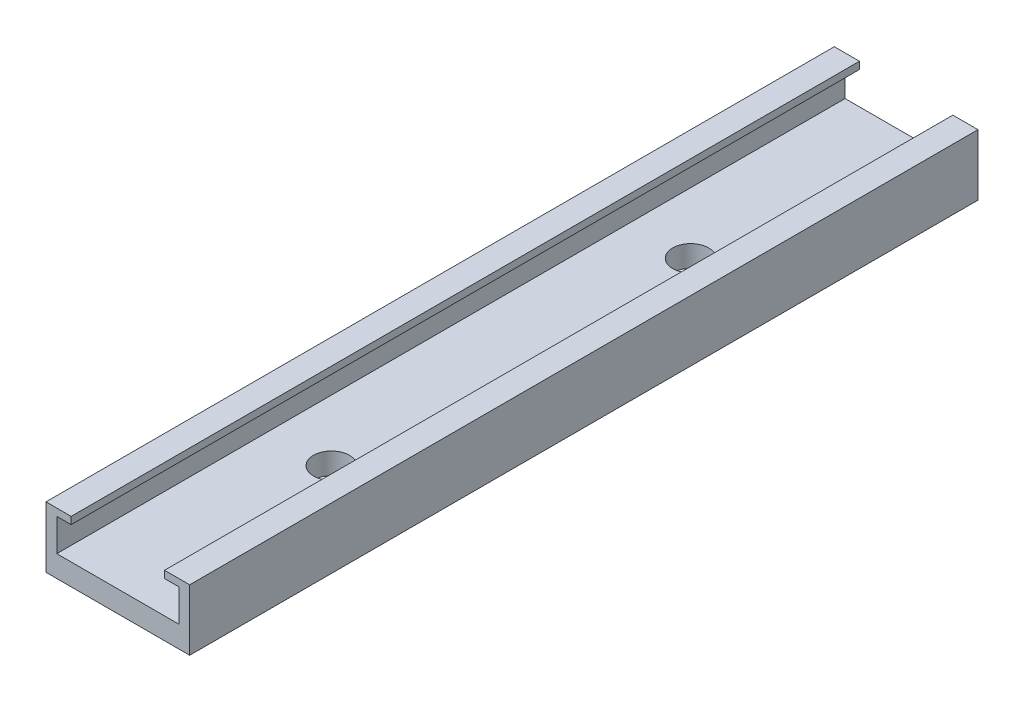
ISO-10303-21;
HEADER;
FILE_DESCRIPTION(('STEP AP214'),'2;1');
FILE_NAME('part.step','',(''),(''),'','','');
FILE_SCHEMA(('AUTOMOTIVE_DESIGN { 1 0 10303 214 1 1 1 1 }'));
ENDSEC;
DATA;
#1=APPLICATION_CONTEXT('core data for automotive mechanical design processes');
#2=APPLICATION_PROTOCOL_DEFINITION('international standard','automotive_design',2000,#1);
#3=PRODUCT_CONTEXT('',#1,'mechanical');
#4=PRODUCT('Part','Part','',(#3));
#5=PRODUCT_RELATED_PRODUCT_CATEGORY('part','',(#4));
#6=PRODUCT_DEFINITION_FORMATION('','',#4);
#7=PRODUCT_DEFINITION_CONTEXT('part definition',#1,'design');
#8=PRODUCT_DEFINITION('design','',#6,#7);
#9=PRODUCT_DEFINITION_SHAPE('','',#8);
#10=(LENGTH_UNIT() NAMED_UNIT(*) SI_UNIT(.MILLI.,.METRE.));
#11=(NAMED_UNIT(*) PLANE_ANGLE_UNIT() SI_UNIT($,.RADIAN.));
#12=(NAMED_UNIT(*) SI_UNIT($,.STERADIAN.) SOLID_ANGLE_UNIT());
#13=UNCERTAINTY_MEASURE_WITH_UNIT(LENGTH_MEASURE(1.E-05),#10,'distance_accuracy_value','');
#14=(GEOMETRIC_REPRESENTATION_CONTEXT(3) GLOBAL_UNCERTAINTY_ASSIGNED_CONTEXT((#13)) GLOBAL_UNIT_ASSIGNED_CONTEXT((#10,
#11,#12)) REPRESENTATION_CONTEXT('',''));
#15=CARTESIAN_POINT('',(0.,0.,0.));
#16=DIRECTION('',(0.,0.,1.));
#17=DIRECTION('',(1.,0.,0.));
#18=AXIS2_PLACEMENT_3D('',#15,#16,#17);
#19=CARTESIAN_POINT('',(10.,0.391567614114092,109.73));
#20=DIRECTION('',(-1.,0.,0.));
#21=DIRECTION('',(0.,-1.,0.));
#22=AXIS2_PLACEMENT_3D('',#19,#20,#21);
#23=PLANE('',#22);
#24=DIRECTION('',(0.,1.,0.));
#25=VECTOR('',#24,1.);
#26=CARTESIAN_POINT('',(10.,0.391567614114092,0.));
#27=LINE('',#26,#25);
#28=CARTESIAN_POINT('',(10.,-8.10843238588591,0.));
#29=VERTEX_POINT('',#28);
#30=CARTESIAN_POINT('',(10.,0.391567614114092,0.));
#31=VERTEX_POINT('',#30);
#32=EDGE_CURVE('E151',#29,#31,#27,.T.);
#33=ORIENTED_EDGE('',*,*,#32,.T.);
#34=DIRECTION('',(0.,0.,-1.));
#35=VECTOR('',#34,1.);
#36=CARTESIAN_POINT('',(10.,0.391567614114092,109.73));
#37=LINE('',#36,#35);
#38=CARTESIAN_POINT('',(10.,0.391567614114092,109.73));
#39=VERTEX_POINT('',#38);
#40=EDGE_CURVE('E11',#39,#31,#37,.T.);
#41=ORIENTED_EDGE('',*,*,#40,.F.);
#42=DIRECTION('',(0.,1.,0.));
#43=VECTOR('',#42,1.);
#44=CARTESIAN_POINT('',(10.,0.391567614114092,109.73));
#45=LINE('',#44,#43);
#46=CARTESIAN_POINT('',(10.,-8.10843238588591,109.73));
#47=VERTEX_POINT('',#46);
#48=EDGE_CURVE('E174',#47,#39,#45,.T.);
#49=ORIENTED_EDGE('',*,*,#48,.F.);
#50=DIRECTION('',(0.,0.,-1.));
#51=VECTOR('',#50,1.);
#52=CARTESIAN_POINT('',(10.,-8.10843238588591,109.73));
#53=LINE('',#52,#51);
#54=EDGE_CURVE('E147',#47,#29,#53,.T.);
#55=ORIENTED_EDGE('',*,*,#54,.T.);
#56=EDGE_LOOP('',(#33,#41,#49,#55));
#57=FACE_BOUND('',#56,.T.);
#58=ADVANCED_FACE('F31',(#57),#23,.F.);
#59=CARTESIAN_POINT('',(10.,0.391567614114092,109.73));
#60=DIRECTION('',(0.,-1.,0.));
#61=DIRECTION('',(1.,0.,0.));
#62=AXIS2_PLACEMENT_3D('',#59,#60,#61);
#63=PLANE('',#62);
#64=DIRECTION('',(-1.,0.,0.));
#65=VECTOR('',#64,1.);
#66=CARTESIAN_POINT('',(10.,0.391567614114092,0.));
#67=LINE('',#66,#65);
#68=CARTESIAN_POINT('',(6.50000000000001,0.391567614114092,0.));
#69=VERTEX_POINT('',#68);
#70=EDGE_CURVE('E154',#31,#69,#67,.T.);
#71=ORIENTED_EDGE('',*,*,#70,.T.);
#72=DIRECTION('',(0.,0.,-1.));
#73=VECTOR('',#72,1.);
#74=CARTESIAN_POINT('',(6.50000000000001,0.391567614114092,109.73));
#75=LINE('',#74,#73);
#76=CARTESIAN_POINT('',(6.50000000000001,0.391567614114092,109.73));
#77=VERTEX_POINT('',#76);
#78=EDGE_CURVE('E39',#77,#69,#75,.T.);
#79=ORIENTED_EDGE('',*,*,#78,.F.);
#80=DIRECTION('',(-1.,0.,0.));
#81=VECTOR('',#80,1.);
#82=CARTESIAN_POINT('',(10.,0.391567614114092,109.73));
#83=LINE('',#82,#81);
#84=EDGE_CURVE('E101',#39,#77,#83,.T.);
#85=ORIENTED_EDGE('',*,*,#84,.F.);
#86=ORIENTED_EDGE('',*,*,#40,.T.);
#87=EDGE_LOOP('',(#71,#79,#85,#86));
#88=FACE_BOUND('',#87,.T.);
#89=ADVANCED_FACE('F255',(#88),#63,.F.);
#90=CARTESIAN_POINT('',(6.50000000000001,0.391567614114092,109.73));
#91=DIRECTION('',(1.,0.,0.));
#92=DIRECTION('',(0.,0.,-1.));
#93=AXIS2_PLACEMENT_3D('',#90,#91,#92);
#94=PLANE('',#93);
#95=DIRECTION('',(0.,-1.,0.));
#96=VECTOR('',#95,1.);
#97=CARTESIAN_POINT('',(6.50000000000001,0.391567614114092,0.));
#98=LINE('',#97,#96);
#99=CARTESIAN_POINT('',(6.50000000000001,-0.608432385885908,0.));
#100=VERTEX_POINT('',#99);
#101=EDGE_CURVE('E157',#69,#100,#98,.T.);
#102=ORIENTED_EDGE('',*,*,#101,.T.);
#103=DIRECTION('',(0.,0.,-1.));
#104=VECTOR('',#103,1.);
#105=CARTESIAN_POINT('',(6.50000000000001,-0.608432385885908,109.73));
#106=LINE('',#105,#104);
#107=CARTESIAN_POINT('',(6.50000000000001,-0.608432385885908,109.73));
#108=VERTEX_POINT('',#107);
#109=EDGE_CURVE('E193',#108,#100,#106,.T.);
#110=ORIENTED_EDGE('',*,*,#109,.F.);
#111=DIRECTION('',(0.,-1.,0.));
#112=VECTOR('',#111,1.);
#113=CARTESIAN_POINT('',(6.50000000000001,0.391567614114092,109.73));
#114=LINE('',#113,#112);
#115=EDGE_CURVE('E201',#77,#108,#114,.T.);
#116=ORIENTED_EDGE('',*,*,#115,.F.);
#117=ORIENTED_EDGE('',*,*,#78,.T.);
#118=EDGE_LOOP('',(#102,#110,#116,#117));
#119=FACE_BOUND('',#118,.T.);
#120=ADVANCED_FACE('F199',(#119),#94,.F.);
#121=CARTESIAN_POINT('',(6.50000000000001,-0.608432385885908,109.73));
#122=DIRECTION('',(0.,1.,0.));
#123=DIRECTION('',(0.,0.,1.));
#124=AXIS2_PLACEMENT_3D('',#121,#122,#123);
#125=PLANE('',#124);
#126=DIRECTION('',(1.,0.,0.));
#127=VECTOR('',#126,1.);
#128=CARTESIAN_POINT('',(6.50000000000001,-0.608432385885908,0.));
#129=LINE('',#128,#127);
#130=CARTESIAN_POINT('',(8.50000000000001,-0.608432385885908,0.));
#131=VERTEX_POINT('',#130);
#132=EDGE_CURVE('E159',#100,#131,#129,.T.);
#133=ORIENTED_EDGE('',*,*,#132,.T.);
#134=DIRECTION('',(0.,0.,-1.));
#135=VECTOR('',#134,1.);
#136=CARTESIAN_POINT('',(8.50000000000001,-0.608432385885908,109.73));
#137=LINE('',#136,#135);
#138=CARTESIAN_POINT('',(8.50000000000001,-0.608432385885908,109.73));
#139=VERTEX_POINT('',#138);
#140=EDGE_CURVE('E190',#139,#131,#137,.T.);
#141=ORIENTED_EDGE('',*,*,#140,.F.);
#142=DIRECTION('',(1.,0.,0.));
#143=VECTOR('',#142,1.);
#144=CARTESIAN_POINT('',(6.50000000000001,-0.608432385885908,109.73));
#145=LINE('',#144,#143);
#146=EDGE_CURVE('E219',#108,#139,#145,.T.);
#147=ORIENTED_EDGE('',*,*,#146,.F.);
#148=ORIENTED_EDGE('',*,*,#109,.T.);
#149=EDGE_LOOP('',(#133,#141,#147,#148));
#150=FACE_BOUND('',#149,.T.);
#151=ADVANCED_FACE('F210',(#150),#125,.F.);
#152=CARTESIAN_POINT('',(8.50000000000001,-0.608432385885908,109.73));
#153=DIRECTION('',(1.,0.,0.));
#154=DIRECTION('',(0.,0.,-1.));
#155=AXIS2_PLACEMENT_3D('',#152,#153,#154);
#156=PLANE('',#155);
#157=DIRECTION('',(0.,-1.,0.));
#158=VECTOR('',#157,1.);
#159=CARTESIAN_POINT('',(8.50000000000001,-0.608432385885908,0.));
#160=LINE('',#159,#158);
#161=CARTESIAN_POINT('',(8.50000000000001,-5.10843238588591,0.));
#162=VERTEX_POINT('',#161);
#163=EDGE_CURVE('E161',#131,#162,#160,.T.);
#164=ORIENTED_EDGE('',*,*,#163,.T.);
#165=DIRECTION('',(0.,0.,-1.));
#166=VECTOR('',#165,1.);
#167=CARTESIAN_POINT('',(8.50000000000001,-5.10843238588591,109.73));
#168=LINE('',#167,#166);
#169=CARTESIAN_POINT('',(8.50000000000001,-5.10843238588591,109.73));
#170=VERTEX_POINT('',#169);
#171=EDGE_CURVE('E187',#170,#162,#168,.T.);
#172=ORIENTED_EDGE('',*,*,#171,.F.);
#173=DIRECTION('',(0.,-1.,0.));
#174=VECTOR('',#173,1.);
#175=CARTESIAN_POINT('',(8.50000000000001,-0.608432385885908,109.73));
#176=LINE('',#175,#174);
#177=EDGE_CURVE('E216',#139,#170,#176,.T.);
#178=ORIENTED_EDGE('',*,*,#177,.F.);
#179=ORIENTED_EDGE('',*,*,#140,.T.);
#180=EDGE_LOOP('',(#164,#172,#178,#179));
#181=FACE_BOUND('',#180,.T.);
#182=ADVANCED_FACE('F214',(#181),#156,.F.);
#183=CARTESIAN_POINT('',(8.50000000000001,-5.10843238588591,109.73));
#184=DIRECTION('',(0.,-1.,0.));
#185=DIRECTION('',(1.,0.,0.));
#186=AXIS2_PLACEMENT_3D('',#183,#184,#185);
#187=PLANE('',#186);
#188=CARTESIAN_POINT('',(0.,-5.10843238588591,80.));
#189=DIRECTION('',(0.,-1.,0.));
#190=DIRECTION('',(1.,0.,0.));
#191=AXIS2_PLACEMENT_3D('',#188,#189,#190);
#192=CIRCLE('',#191,2.5);
#193=CARTESIAN_POINT('',(2.5,-5.10843238588591,80.));
#194=VERTEX_POINT('',#193);
#195=EDGE_CURVE('E344',#194,#194,#192,.T.);
#196=ORIENTED_EDGE('',*,*,#195,.T.);
#197=EDGE_LOOP('',(#196));
#198=FACE_BOUND('',#197,.T.);
#199=CARTESIAN_POINT('',(0.,-5.10843238588591,30.));
#200=DIRECTION('',(0.,-1.,0.));
#201=DIRECTION('',(1.,0.,0.));
#202=AXIS2_PLACEMENT_3D('',#199,#200,#201);
#203=CIRCLE('',#202,2.5);
#204=CARTESIAN_POINT('',(2.5,-5.10843238588591,30.));
#205=VERTEX_POINT('',#204);
#206=EDGE_CURVE('E155',#205,#205,#203,.T.);
#207=ORIENTED_EDGE('',*,*,#206,.T.);
#208=EDGE_LOOP('',(#207));
#209=FACE_BOUND('',#208,.T.);
#210=DIRECTION('',(-1.,0.,0.));
#211=VECTOR('',#210,1.);
#212=CARTESIAN_POINT('',(8.50000000000001,-5.10843238588591,0.));
#213=LINE('',#212,#211);
#214=CARTESIAN_POINT('',(-8.49999999999999,-5.10843238588591,0.));
#215=VERTEX_POINT('',#214);
#216=EDGE_CURVE('E163',#162,#215,#213,.T.);
#217=ORIENTED_EDGE('',*,*,#216,.T.);
#218=DIRECTION('',(0.,0.,-1.));
#219=VECTOR('',#218,1.);
#220=CARTESIAN_POINT('',(-8.49999999999999,-5.10843238588591,109.73));
#221=LINE('',#220,#219);
#222=CARTESIAN_POINT('',(-8.49999999999999,-5.10843238588591,109.73));
#223=VERTEX_POINT('',#222);
#224=EDGE_CURVE('E184',#223,#215,#221,.T.);
#225=ORIENTED_EDGE('',*,*,#224,.F.);
#226=DIRECTION('',(-1.,0.,0.));
#227=VECTOR('',#226,1.);
#228=CARTESIAN_POINT('',(8.50000000000001,-5.10843238588591,109.73));
#229=LINE('',#228,#227);
#230=EDGE_CURVE('E218',#170,#223,#229,.T.);
#231=ORIENTED_EDGE('',*,*,#230,.F.);
#232=ORIENTED_EDGE('',*,*,#171,.T.);
#233=EDGE_LOOP('',(#217,#225,#231,#232));
#234=FACE_BOUND('',#233,.T.);
#235=ADVANCED_FACE('F268',(#198,#209,#234),#187,.F.);
#236=CARTESIAN_POINT('',(-8.49999999999999,-5.10843238588591,109.73));
#237=DIRECTION('',(-1.,0.,0.));
#238=DIRECTION('',(0.,0.,1.));
#239=AXIS2_PLACEMENT_3D('',#236,#237,#238);
#240=PLANE('',#239);
#241=DIRECTION('',(0.,1.,0.));
#242=VECTOR('',#241,1.);
#243=CARTESIAN_POINT('',(-8.49999999999999,-5.10843238588591,0.));
#244=LINE('',#243,#242);
#245=CARTESIAN_POINT('',(-8.49999999999999,-0.60843238588591,0.));
#246=VERTEX_POINT('',#245);
#247=EDGE_CURVE('E165',#215,#246,#244,.T.);
#248=ORIENTED_EDGE('',*,*,#247,.T.);
#249=DIRECTION('',(0.,0.,-1.));
#250=VECTOR('',#249,1.);
#251=CARTESIAN_POINT('',(-8.49999999999999,-0.60843238588591,109.73));
#252=LINE('',#251,#250);
#253=CARTESIAN_POINT('',(-8.49999999999999,-0.60843238588591,109.73));
#254=VERTEX_POINT('',#253);
#255=EDGE_CURVE('E181',#254,#246,#252,.T.);
#256=ORIENTED_EDGE('',*,*,#255,.F.);
#257=DIRECTION('',(0.,1.,0.));
#258=VECTOR('',#257,1.);
#259=CARTESIAN_POINT('',(-8.49999999999999,-5.10843238588591,109.73));
#260=LINE('',#259,#258);
#261=EDGE_CURVE('E221',#223,#254,#260,.T.);
#262=ORIENTED_EDGE('',*,*,#261,.F.);
#263=ORIENTED_EDGE('',*,*,#224,.T.);
#264=EDGE_LOOP('',(#248,#256,#262,#263));
#265=FACE_BOUND('',#264,.T.);
#266=ADVANCED_FACE('F271',(#265),#240,.F.);
#267=CARTESIAN_POINT('',(-8.49999999999999,-0.60843238588591,109.73));
#268=DIRECTION('',(0.,1.,0.));
#269=DIRECTION('',(0.,0.,1.));
#270=AXIS2_PLACEMENT_3D('',#267,#268,#269);
#271=PLANE('',#270);
#272=DIRECTION('',(1.,0.,0.));
#273=VECTOR('',#272,1.);
#274=CARTESIAN_POINT('',(-8.49999999999999,-0.60843238588591,0.));
#275=LINE('',#274,#273);
#276=CARTESIAN_POINT('',(-6.5,-0.60843238588591,0.));
#277=VERTEX_POINT('',#276);
#278=EDGE_CURVE('E167',#246,#277,#275,.T.);
#279=ORIENTED_EDGE('',*,*,#278,.T.);
#280=DIRECTION('',(0.,0.,-1.));
#281=VECTOR('',#280,1.);
#282=CARTESIAN_POINT('',(-6.5,-0.60843238588591,109.73));
#283=LINE('',#282,#281);
#284=CARTESIAN_POINT('',(-6.5,-0.60843238588591,109.73));
#285=VERTEX_POINT('',#284);
#286=EDGE_CURVE('E178',#285,#277,#283,.T.);
#287=ORIENTED_EDGE('',*,*,#286,.F.);
#288=DIRECTION('',(1.,0.,0.));
#289=VECTOR('',#288,1.);
#290=CARTESIAN_POINT('',(-8.49999999999999,-0.60843238588591,109.73));
#291=LINE('',#290,#289);
#292=EDGE_CURVE('E227',#254,#285,#291,.T.);
#293=ORIENTED_EDGE('',*,*,#292,.F.);
#294=ORIENTED_EDGE('',*,*,#255,.T.);
#295=EDGE_LOOP('',(#279,#287,#293,#294));
#296=FACE_BOUND('',#295,.T.);
#297=ADVANCED_FACE('F233',(#296),#271,.F.);
#298=CARTESIAN_POINT('',(-6.5,-0.60843238588591,109.73));
#299=DIRECTION('',(-1.,0.,0.));
#300=DIRECTION('',(0.,0.,1.));
#301=AXIS2_PLACEMENT_3D('',#298,#299,#300);
#302=PLANE('',#301);
#303=DIRECTION('',(0.,1.,0.));
#304=VECTOR('',#303,1.);
#305=CARTESIAN_POINT('',(-6.5,-0.60843238588591,0.));
#306=LINE('',#305,#304);
#307=CARTESIAN_POINT('',(-6.5,0.391567614114091,0.));
#308=VERTEX_POINT('',#307);
#309=EDGE_CURVE('E169',#277,#308,#306,.T.);
#310=ORIENTED_EDGE('',*,*,#309,.T.);
#311=DIRECTION('',(0.,0.,-1.));
#312=VECTOR('',#311,1.);
#313=CARTESIAN_POINT('',(-6.5,0.391567614114091,109.73));
#314=LINE('',#313,#312);
#315=CARTESIAN_POINT('',(-6.5,0.391567614114091,109.73));
#316=VERTEX_POINT('',#315);
#317=EDGE_CURVE('E142',#316,#308,#314,.T.);
#318=ORIENTED_EDGE('',*,*,#317,.F.);
#319=DIRECTION('',(0.,1.,0.));
#320=VECTOR('',#319,1.);
#321=CARTESIAN_POINT('',(-6.5,-0.60843238588591,109.73));
#322=LINE('',#321,#320);
#323=EDGE_CURVE('E132',#285,#316,#322,.T.);
#324=ORIENTED_EDGE('',*,*,#323,.F.);
#325=ORIENTED_EDGE('',*,*,#286,.T.);
#326=EDGE_LOOP('',(#310,#318,#324,#325));
#327=FACE_BOUND('',#326,.T.);
#328=ADVANCED_FACE('F237',(#327),#302,.F.);
#329=CARTESIAN_POINT('',(-6.5,0.391567614114091,109.73));
#330=DIRECTION('',(0.,-1.,0.));
#331=DIRECTION('',(1.,0.,0.));
#332=AXIS2_PLACEMENT_3D('',#329,#330,#331);
#333=PLANE('',#332);
#334=DIRECTION('',(-1.,0.,0.));
#335=VECTOR('',#334,1.);
#336=CARTESIAN_POINT('',(-6.5,0.391567614114091,0.));
#337=LINE('',#336,#335);
#338=CARTESIAN_POINT('',(-9.99999999999999,0.39156761411409,0.));
#339=VERTEX_POINT('',#338);
#340=EDGE_CURVE('E141',#308,#339,#337,.T.);
#341=ORIENTED_EDGE('',*,*,#340,.T.);
#342=DIRECTION('',(0.,0.,-1.));
#343=VECTOR('',#342,1.);
#344=CARTESIAN_POINT('',(-9.99999999999999,0.39156761411409,109.73));
#345=LINE('',#344,#343);
#346=CARTESIAN_POINT('',(-9.99999999999999,0.39156761411409,109.73));
#347=VERTEX_POINT('',#346);
#348=EDGE_CURVE('E138',#347,#339,#345,.T.);
#349=ORIENTED_EDGE('',*,*,#348,.F.);
#350=DIRECTION('',(-1.,0.,0.));
#351=VECTOR('',#350,1.);
#352=CARTESIAN_POINT('',(-6.5,0.391567614114091,109.73));
#353=LINE('',#352,#351);
#354=EDGE_CURVE('E126',#316,#347,#353,.T.);
#355=ORIENTED_EDGE('',*,*,#354,.F.);
#356=ORIENTED_EDGE('',*,*,#317,.T.);
#357=EDGE_LOOP('',(#341,#349,#355,#356));
#358=FACE_BOUND('',#357,.T.);
#359=ADVANCED_FACE('F139',(#358),#333,.F.);
#360=CARTESIAN_POINT('',(-9.99999999999999,-3.57658000609991,109.73));
#361=DIRECTION('',(1.,0.,0.));
#362=DIRECTION('',(0.,0.,-1.));
#363=AXIS2_PLACEMENT_3D('',#360,#361,#362);
#364=PLANE('',#363);
#365=DIRECTION('',(0.,-1.,0.));
#366=VECTOR('',#365,1.);
#367=CARTESIAN_POINT('',(-9.99999999999999,-3.57658000609991,0.));
#368=LINE('',#367,#366);
#369=CARTESIAN_POINT('',(-9.99999999999999,-8.10843238588591,0.));
#370=VERTEX_POINT('',#369);
#371=EDGE_CURVE('E87',#339,#370,#368,.T.);
#372=ORIENTED_EDGE('',*,*,#371,.T.);
#373=DIRECTION('',(0.,0.,-1.));
#374=VECTOR('',#373,1.);
#375=CARTESIAN_POINT('',(-9.99999999999999,-8.10843238588591,109.73));
#376=LINE('',#375,#374);
#377=CARTESIAN_POINT('',(-9.99999999999999,-8.10843238588591,109.73));
#378=VERTEX_POINT('',#377);
#379=EDGE_CURVE('E143',#378,#370,#376,.T.);
#380=ORIENTED_EDGE('',*,*,#379,.F.);
#381=DIRECTION('',(0.,-1.,0.));
#382=VECTOR('',#381,1.);
#383=CARTESIAN_POINT('',(-9.99999999999999,0.39156761411409,109.73));
#384=LINE('',#383,#382);
#385=EDGE_CURVE('E130',#347,#378,#384,.T.);
#386=ORIENTED_EDGE('',*,*,#385,.F.);
#387=ORIENTED_EDGE('',*,*,#348,.T.);
#388=EDGE_LOOP('',(#372,#380,#386,#387));
#389=FACE_BOUND('',#388,.T.);
#390=ADVANCED_FACE('F145',(#389),#364,.F.);
#391=CARTESIAN_POINT('',(-9.99999999999999,-8.10843238588591,109.73));
#392=DIRECTION('',(0.,1.,0.));
#393=DIRECTION('',(0.,0.,1.));
#394=AXIS2_PLACEMENT_3D('',#391,#392,#393);
#395=PLANE('',#394);
#396=CARTESIAN_POINT('',(0.,-8.10843238588591,80.));
#397=DIRECTION('',(0.,-1.,0.));
#398=DIRECTION('',(1.,0.,0.));
#399=AXIS2_PLACEMENT_3D('',#396,#397,#398);
#400=CIRCLE('',#399,2.5);
#401=CARTESIAN_POINT('',(2.5,-8.10843238588591,80.));
#402=VERTEX_POINT('',#401);
#403=EDGE_CURVE('E341',#402,#402,#400,.T.);
#404=ORIENTED_EDGE('',*,*,#403,.F.);
#405=EDGE_LOOP('',(#404));
#406=FACE_BOUND('',#405,.T.);
#407=CARTESIAN_POINT('',(0.,-8.10843238588591,30.));
#408=DIRECTION('',(0.,-1.,0.));
#409=DIRECTION('',(1.,0.,0.));
#410=AXIS2_PLACEMENT_3D('',#407,#408,#409);
#411=CIRCLE('',#410,2.5);
#412=CARTESIAN_POINT('',(2.5,-8.10843238588591,30.));
#413=VERTEX_POINT('',#412);
#414=EDGE_CURVE('E345',#413,#413,#411,.T.);
#415=ORIENTED_EDGE('',*,*,#414,.F.);
#416=EDGE_LOOP('',(#415));
#417=FACE_BOUND('',#416,.T.);
#418=DIRECTION('',(1.,0.,0.));
#419=VECTOR('',#418,1.);
#420=CARTESIAN_POINT('',(-9.99999999999999,-8.10843238588591,0.));
#421=LINE('',#420,#419);
#422=EDGE_CURVE('E93',#370,#29,#421,.T.);
#423=ORIENTED_EDGE('',*,*,#422,.T.);
#424=ORIENTED_EDGE('',*,*,#54,.F.);
#425=DIRECTION('',(1.,0.,0.));
#426=VECTOR('',#425,1.);
#427=CARTESIAN_POINT('',(-9.99999999999999,-8.10843238588591,109.73));
#428=LINE('',#427,#426);
#429=EDGE_CURVE('E47',#378,#47,#428,.T.);
#430=ORIENTED_EDGE('',*,*,#429,.F.);
#431=ORIENTED_EDGE('',*,*,#379,.T.);
#432=EDGE_LOOP('',(#423,#424,#430,#431));
#433=FACE_BOUND('',#432,.T.);
#434=ADVANCED_FACE('F241',(#406,#417,#433),#395,.F.);
#435=CARTESIAN_POINT('',(10.,-8.10843238588591,109.73));
#436=DIRECTION('',(0.,0.,1.));
#437=DIRECTION('',(1.,0.,0.));
#438=AXIS2_PLACEMENT_3D('',#435,#436,#437);
#439=PLANE('',#438);
#440=ORIENTED_EDGE('',*,*,#48,.T.);
#441=ORIENTED_EDGE('',*,*,#84,.T.);
#442=ORIENTED_EDGE('',*,*,#115,.T.);
#443=ORIENTED_EDGE('',*,*,#146,.T.);
#444=ORIENTED_EDGE('',*,*,#177,.T.);
#445=ORIENTED_EDGE('',*,*,#230,.T.);
#446=ORIENTED_EDGE('',*,*,#261,.T.);
#447=ORIENTED_EDGE('',*,*,#292,.T.);
#448=ORIENTED_EDGE('',*,*,#323,.T.);
#449=ORIENTED_EDGE('',*,*,#354,.T.);
#450=ORIENTED_EDGE('',*,*,#385,.T.);
#451=ORIENTED_EDGE('',*,*,#429,.T.);
#452=EDGE_LOOP('',(#440,#441,#442,#443,#444,#445,#446,#447,#448,#449,#450,#451));
#453=FACE_BOUND('',#452,.T.);
#454=ADVANCED_FACE('F128',(#453),#439,.T.);
#455=CARTESIAN_POINT('',(10.,-8.10843238588591,0.));
#456=DIRECTION('',(0.,0.,1.));
#457=DIRECTION('',(1.,0.,0.));
#458=AXIS2_PLACEMENT_3D('',#455,#456,#457);
#459=PLANE('',#458);
#460=ORIENTED_EDGE('',*,*,#32,.F.);
#461=ORIENTED_EDGE('',*,*,#422,.F.);
#462=ORIENTED_EDGE('',*,*,#371,.F.);
#463=ORIENTED_EDGE('',*,*,#340,.F.);
#464=ORIENTED_EDGE('',*,*,#309,.F.);
#465=ORIENTED_EDGE('',*,*,#278,.F.);
#466=ORIENTED_EDGE('',*,*,#247,.F.);
#467=ORIENTED_EDGE('',*,*,#216,.F.);
#468=ORIENTED_EDGE('',*,*,#163,.F.);
#469=ORIENTED_EDGE('',*,*,#132,.F.);
#470=ORIENTED_EDGE('',*,*,#101,.F.);
#471=ORIENTED_EDGE('',*,*,#70,.F.);
#472=EDGE_LOOP('',(#460,#461,#462,#463,#464,#465,#466,#467,#468,#469,#470,#471));
#473=FACE_BOUND('',#472,.T.);
#474=ADVANCED_FACE('F205',(#473),#459,.F.);
#475=CARTESIAN_POINT('',(0.,1.89156761411409,30.));
#476=DIRECTION('',(0.,-1.,0.));
#477=DIRECTION('',(1.,0.,0.));
#478=AXIS2_PLACEMENT_3D('',#475,#476,#477);
#479=CYLINDRICAL_SURFACE('',#478,2.5);
#480=ORIENTED_EDGE('',*,*,#414,.T.);
#481=EDGE_LOOP('',(#480));
#482=FACE_BOUND('',#481,.T.);
#483=ORIENTED_EDGE('',*,*,#206,.F.);
#484=EDGE_LOOP('',(#483));
#485=FACE_BOUND('',#484,.T.);
#486=ADVANCED_FACE('F306',(#482,#485),#479,.F.);
#487=CARTESIAN_POINT('',(0.,1.89156761411409,80.));
#488=DIRECTION('',(0.,-1.,0.));
#489=DIRECTION('',(1.,0.,0.));
#490=AXIS2_PLACEMENT_3D('',#487,#488,#489);
#491=CYLINDRICAL_SURFACE('',#490,2.5);
#492=ORIENTED_EDGE('',*,*,#403,.T.);
#493=EDGE_LOOP('',(#492));
#494=FACE_BOUND('',#493,.T.);
#495=ORIENTED_EDGE('',*,*,#195,.F.);
#496=EDGE_LOOP('',(#495));
#497=FACE_BOUND('',#496,.T.);
#498=ADVANCED_FACE('F325',(#494,#497),#491,.F.);
#499=CLOSED_SHELL('',(#58,#89,#120,#151,#182,#235,#266,#297,#328,#359,#390,#434,#454,#474,#486,#498));
#500=MANIFOLD_SOLID_BREP('B2',#499);
#501=ADVANCED_BREP_SHAPE_REPRESENTATION('',(#18,#500),#14);
#502=SHAPE_DEFINITION_REPRESENTATION(#9,#501);
ENDSEC;
END-ISO-10303-21;
